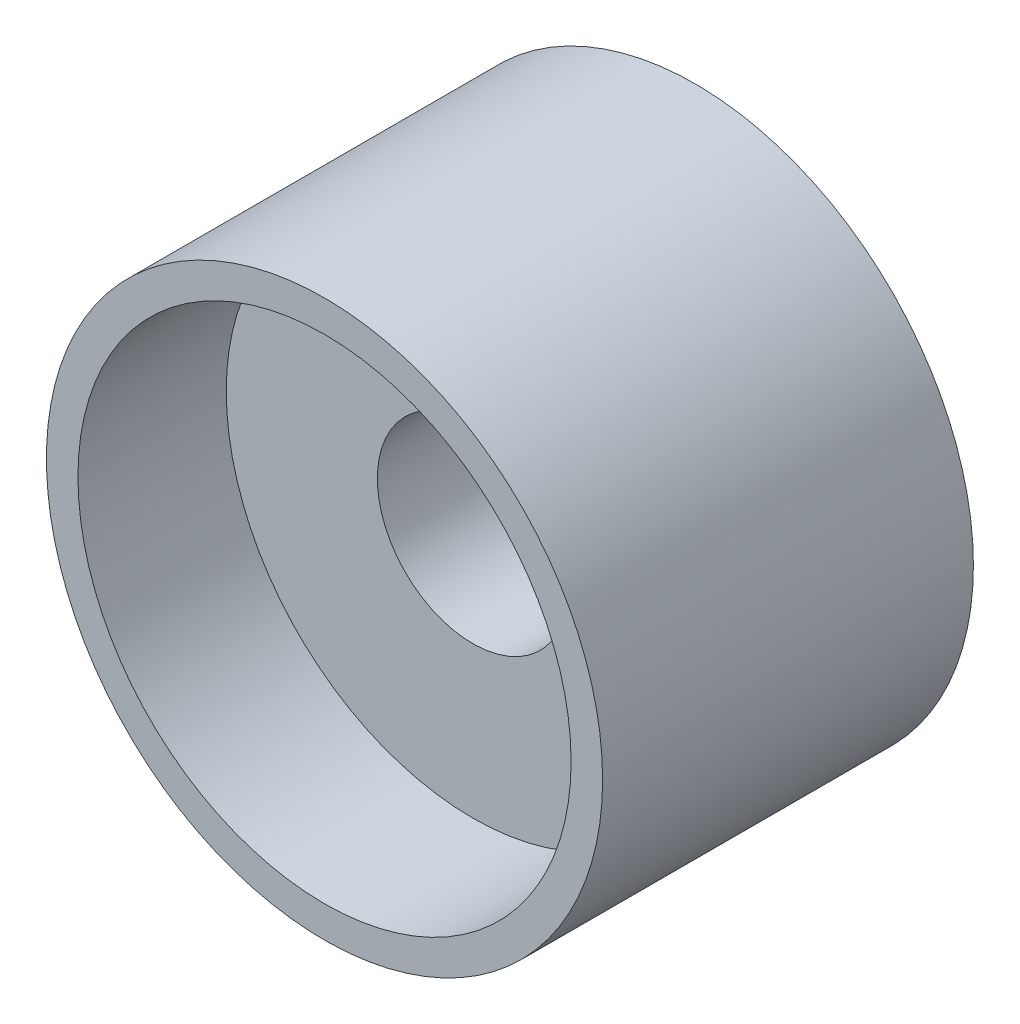
ISO-10303-21;
HEADER;
FILE_DESCRIPTION(('STEP AP214'),'2;1');
FILE_NAME('part.step','',(''),(''),'','','');
FILE_SCHEMA(('AUTOMOTIVE_DESIGN { 1 0 10303 214 1 1 1 1 }'));
ENDSEC;
DATA;
#1=APPLICATION_CONTEXT('core data for automotive mechanical design processes');
#2=APPLICATION_PROTOCOL_DEFINITION('international standard','automotive_design',2000,#1);
#3=PRODUCT_CONTEXT('',#1,'mechanical');
#4=PRODUCT('Part','Part','',(#3));
#5=PRODUCT_RELATED_PRODUCT_CATEGORY('part','',(#4));
#6=PRODUCT_DEFINITION_FORMATION('','',#4);
#7=PRODUCT_DEFINITION_CONTEXT('part definition',#1,'design');
#8=PRODUCT_DEFINITION('design','',#6,#7);
#9=PRODUCT_DEFINITION_SHAPE('','',#8);
#10=(LENGTH_UNIT() NAMED_UNIT(*) SI_UNIT(.MILLI.,.METRE.));
#11=(NAMED_UNIT(*) PLANE_ANGLE_UNIT() SI_UNIT($,.RADIAN.));
#12=(NAMED_UNIT(*) SI_UNIT($,.STERADIAN.) SOLID_ANGLE_UNIT());
#13=UNCERTAINTY_MEASURE_WITH_UNIT(LENGTH_MEASURE(1.E-05),#10,'distance_accuracy_value','');
#14=(GEOMETRIC_REPRESENTATION_CONTEXT(3) GLOBAL_UNCERTAINTY_ASSIGNED_CONTEXT((#13)) GLOBAL_UNIT_ASSIGNED_CONTEXT((#10,
#11,#12)) REPRESENTATION_CONTEXT('',''));
#15=CARTESIAN_POINT('',(0.,0.,0.));
#16=DIRECTION('',(0.,0.,1.));
#17=DIRECTION('',(1.,0.,0.));
#18=AXIS2_PLACEMENT_3D('',#15,#16,#17);
#19=CARTESIAN_POINT('',(0.,0.,20.));
#20=DIRECTION('',(0.,0.,-1.));
#21=DIRECTION('',(-1.,0.,0.));
#22=AXIS2_PLACEMENT_3D('',#19,#20,#21);
#23=CYLINDRICAL_SURFACE('',#22,5.15);
#24=CARTESIAN_POINT('',(0.,0.,0.));
#25=DIRECTION('',(0.,0.,1.));
#26=DIRECTION('',(1.,0.,0.));
#27=AXIS2_PLACEMENT_3D('',#24,#25,#26);
#28=CIRCLE('',#27,5.15);
#29=CARTESIAN_POINT('',(5.15,0.,0.));
#30=VERTEX_POINT('',#29);
#31=EDGE_CURVE('E44',#30,#30,#28,.T.);
#32=ORIENTED_EDGE('',*,*,#31,.F.);
#33=EDGE_LOOP('',(#32));
#34=FACE_BOUND('',#33,.T.);
#35=CARTESIAN_POINT('',(0.,0.,12.));
#36=DIRECTION('',(0.,0.,1.));
#37=DIRECTION('',(1.,0.,0.));
#38=AXIS2_PLACEMENT_3D('',#35,#36,#37);
#39=CIRCLE('',#38,5.15);
#40=CARTESIAN_POINT('',(5.15,0.,12.));
#41=VERTEX_POINT('',#40);
#42=EDGE_CURVE('E35',#41,#41,#39,.T.);
#43=ORIENTED_EDGE('',*,*,#42,.T.);
#44=EDGE_LOOP('',(#43));
#45=FACE_BOUND('',#44,.T.);
#46=ADVANCED_FACE('F31',(#34,#45),#23,.F.);
#47=CARTESIAN_POINT('',(0.,0.,20.));
#48=DIRECTION('',(0.,0.,1.));
#49=DIRECTION('',(1.,0.,0.));
#50=AXIS2_PLACEMENT_3D('',#47,#48,#49);
#51=PLANE('',#50);
#52=CARTESIAN_POINT('',(0.,0.,20.));
#53=DIRECTION('',(0.,0.,1.));
#54=DIRECTION('',(1.,0.,0.));
#55=AXIS2_PLACEMENT_3D('',#52,#53,#54);
#56=CIRCLE('',#55,13.3);
#57=CARTESIAN_POINT('',(13.3,0.,20.));
#58=VERTEX_POINT('',#57);
#59=EDGE_CURVE('E48',#58,#58,#56,.T.);
#60=ORIENTED_EDGE('',*,*,#59,.F.);
#61=EDGE_LOOP('',(#60));
#62=FACE_BOUND('',#61,.T.);
#63=CARTESIAN_POINT('',(0.,0.,20.));
#64=DIRECTION('',(0.,0.,1.));
#65=DIRECTION('',(1.,0.,0.));
#66=AXIS2_PLACEMENT_3D('',#63,#64,#65);
#67=CIRCLE('',#66,15.);
#68=CARTESIAN_POINT('',(15.,0.,20.));
#69=VERTEX_POINT('',#68);
#70=EDGE_CURVE('E10',#69,#69,#67,.T.);
#71=ORIENTED_EDGE('',*,*,#70,.T.);
#72=EDGE_LOOP('',(#71));
#73=FACE_BOUND('',#72,.T.);
#74=ADVANCED_FACE('F69',(#62,#73),#51,.T.);
#75=CARTESIAN_POINT('',(0.,0.,0.));
#76=DIRECTION('',(0.,0.,1.));
#77=DIRECTION('',(1.,0.,0.));
#78=AXIS2_PLACEMENT_3D('',#75,#76,#77);
#79=PLANE('',#78);
#80=CARTESIAN_POINT('',(0.,0.,0.));
#81=DIRECTION('',(0.,0.,1.));
#82=DIRECTION('',(1.,0.,0.));
#83=AXIS2_PLACEMENT_3D('',#80,#81,#82);
#84=CIRCLE('',#83,15.);
#85=CARTESIAN_POINT('',(15.,0.,0.));
#86=VERTEX_POINT('',#85);
#87=EDGE_CURVE('E39',#86,#86,#84,.T.);
#88=ORIENTED_EDGE('',*,*,#87,.F.);
#89=EDGE_LOOP('',(#88));
#90=FACE_BOUND('',#89,.T.);
#91=ORIENTED_EDGE('',*,*,#31,.T.);
#92=EDGE_LOOP('',(#91));
#93=FACE_BOUND('',#92,.T.);
#94=ADVANCED_FACE('F75',(#90,#93),#79,.F.);
#95=CARTESIAN_POINT('',(0.,0.,20.));
#96=DIRECTION('',(0.,0.,-1.));
#97=DIRECTION('',(-1.,0.,0.));
#98=AXIS2_PLACEMENT_3D('',#95,#96,#97);
#99=CYLINDRICAL_SURFACE('',#98,15.);
#100=ORIENTED_EDGE('',*,*,#70,.F.);
#101=EDGE_LOOP('',(#100));
#102=FACE_BOUND('',#101,.T.);
#103=ORIENTED_EDGE('',*,*,#87,.T.);
#104=EDGE_LOOP('',(#103));
#105=FACE_BOUND('',#104,.T.);
#106=ADVANCED_FACE('F33',(#102,#105),#99,.T.);
#107=CARTESIAN_POINT('',(0.,0.,12.));
#108=DIRECTION('',(0.,0.,1.));
#109=DIRECTION('',(1.,0.,0.));
#110=AXIS2_PLACEMENT_3D('',#107,#108,#109);
#111=CYLINDRICAL_SURFACE('',#110,13.3);
#112=CARTESIAN_POINT('',(0.,0.,12.));
#113=DIRECTION('',(0.,0.,1.));
#114=DIRECTION('',(1.,0.,0.));
#115=AXIS2_PLACEMENT_3D('',#112,#113,#114);
#116=CIRCLE('',#115,13.3);
#117=CARTESIAN_POINT('',(13.3,0.,12.));
#118=VERTEX_POINT('',#117);
#119=EDGE_CURVE('E51',#118,#118,#116,.T.);
#120=ORIENTED_EDGE('',*,*,#119,.F.);
#121=EDGE_LOOP('',(#120));
#122=FACE_BOUND('',#121,.T.);
#123=ORIENTED_EDGE('',*,*,#59,.T.);
#124=EDGE_LOOP('',(#123));
#125=FACE_BOUND('',#124,.T.);
#126=ADVANCED_FACE('F61',(#122,#125),#111,.F.);
#127=CARTESIAN_POINT('',(0.,0.,12.));
#128=DIRECTION('',(0.,0.,1.));
#129=DIRECTION('',(1.,0.,0.));
#130=AXIS2_PLACEMENT_3D('',#127,#128,#129);
#131=PLANE('',#130);
#132=ORIENTED_EDGE('',*,*,#42,.F.);
#133=EDGE_LOOP('',(#132));
#134=FACE_BOUND('',#133,.T.);
#135=ORIENTED_EDGE('',*,*,#119,.T.);
#136=EDGE_LOOP('',(#135));
#137=FACE_BOUND('',#136,.T.);
#138=ADVANCED_FACE('F59',(#134,#137),#131,.T.);
#139=CLOSED_SHELL('',(#46,#74,#94,#106,#126,#138));
#140=MANIFOLD_SOLID_BREP('B2',#139);
#141=ADVANCED_BREP_SHAPE_REPRESENTATION('',(#18,#140),#14);
#142=SHAPE_DEFINITION_REPRESENTATION(#9,#141);
ENDSEC;
END-ISO-10303-21;
